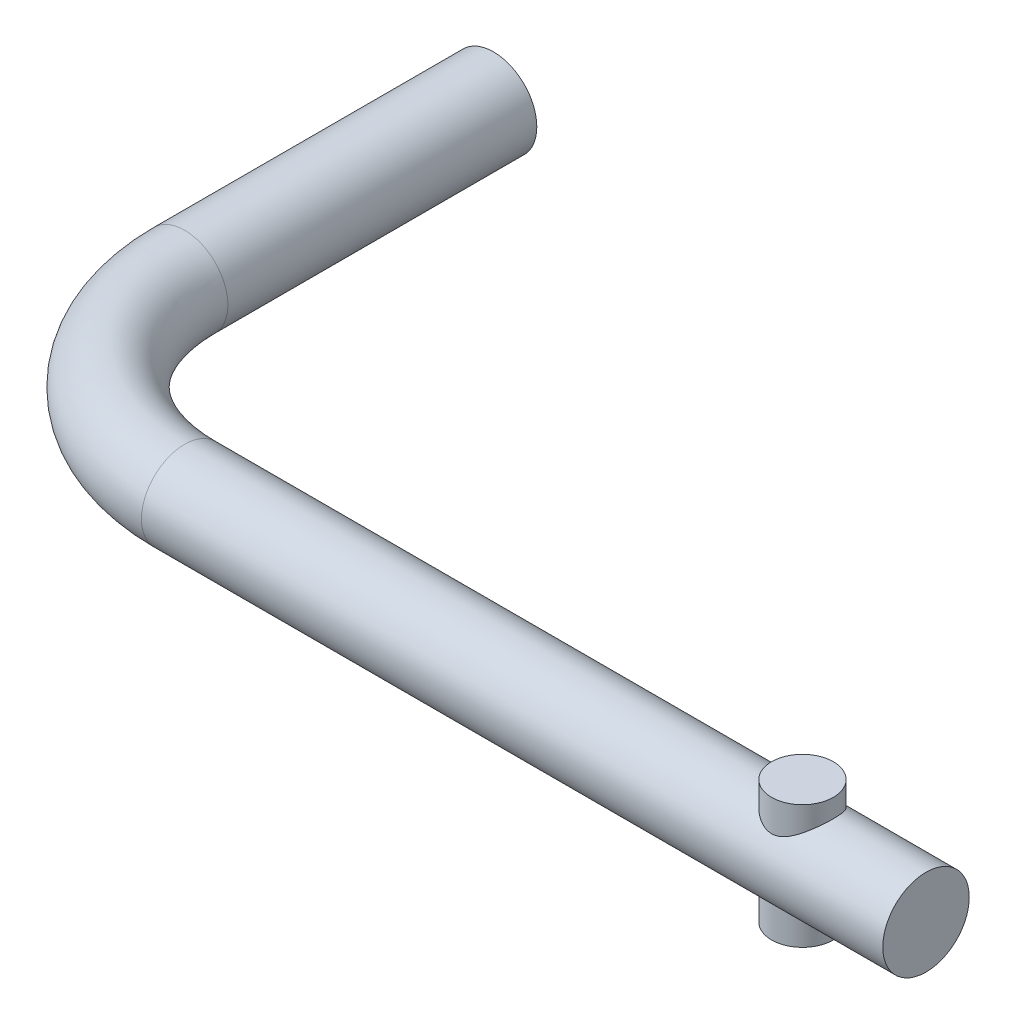
ISO-10303-21;
HEADER;
FILE_DESCRIPTION(('STEP AP214'),'2;1');
FILE_NAME('part.step','',(''),(''),'','','');
FILE_SCHEMA(('AUTOMOTIVE_DESIGN { 1 0 10303 214 1 1 1 1 }'));
ENDSEC;
DATA;
#1=APPLICATION_CONTEXT('core data for automotive mechanical design processes');
#2=APPLICATION_PROTOCOL_DEFINITION('international standard','automotive_design',2000,#1);
#3=PRODUCT_CONTEXT('',#1,'mechanical');
#4=PRODUCT('Part','Part','',(#3));
#5=PRODUCT_RELATED_PRODUCT_CATEGORY('part','',(#4));
#6=PRODUCT_DEFINITION_FORMATION('','',#4);
#7=PRODUCT_DEFINITION_CONTEXT('part definition',#1,'design');
#8=PRODUCT_DEFINITION('design','',#6,#7);
#9=PRODUCT_DEFINITION_SHAPE('','',#8);
#10=(LENGTH_UNIT() NAMED_UNIT(*) SI_UNIT(.MILLI.,.METRE.));
#11=(NAMED_UNIT(*) PLANE_ANGLE_UNIT() SI_UNIT($,.RADIAN.));
#12=(NAMED_UNIT(*) SI_UNIT($,.STERADIAN.) SOLID_ANGLE_UNIT());
#13=UNCERTAINTY_MEASURE_WITH_UNIT(LENGTH_MEASURE(1.E-05),#10,'distance_accuracy_value','');
#14=(GEOMETRIC_REPRESENTATION_CONTEXT(3) GLOBAL_UNCERTAINTY_ASSIGNED_CONTEXT((#13)) GLOBAL_UNIT_ASSIGNED_CONTEXT((#10,
#11,#12)) REPRESENTATION_CONTEXT('',''));
#15=CARTESIAN_POINT('',(0.,0.,0.));
#16=DIRECTION('',(0.,0.,1.));
#17=DIRECTION('',(1.,0.,0.));
#18=AXIS2_PLACEMENT_3D('',#15,#16,#17);
#19=CARTESIAN_POINT('',(0.,0.,0.));
#20=DIRECTION('',(1.,0.,0.));
#21=DIRECTION('',(0.,0.,-1.));
#22=AXIS2_PLACEMENT_3D('',#19,#20,#21);
#23=PLANE('',#22);
#24=CARTESIAN_POINT('',(0.,0.,0.));
#25=DIRECTION('',(1.,0.,0.));
#26=DIRECTION('',(0.,0.,-1.));
#27=AXIS2_PLACEMENT_3D('',#24,#25,#26);
#28=CIRCLE('',#27,7.00000000000001);
#29=CARTESIAN_POINT('',(0.,0.,-7.00000000000001));
#30=VERTEX_POINT('',#29);
#31=EDGE_CURVE('E113',#30,#30,#28,.T.);
#32=ORIENTED_EDGE('',*,*,#31,.T.);
#33=EDGE_LOOP('',(#32));
#34=FACE_BOUND('',#33,.T.);
#35=ADVANCED_FACE('F49',(#34),#23,.T.);
#36=CARTESIAN_POINT('',(-150.,0.,-80.));
#37=DIRECTION('',(0.,0.,1.));
#38=DIRECTION('',(1.,0.,0.));
#39=AXIS2_PLACEMENT_3D('',#36,#37,#38);
#40=PLANE('',#39);
#41=CARTESIAN_POINT('',(-150.,0.,-80.));
#42=DIRECTION('',(0.,0.,1.));
#43=DIRECTION('',(1.,0.,0.));
#44=AXIS2_PLACEMENT_3D('',#41,#42,#43);
#45=CIRCLE('',#44,7.00000000000001);
#46=CARTESIAN_POINT('',(-143.,0.,-80.));
#47=VERTEX_POINT('',#46);
#48=EDGE_CURVE('E11',#47,#47,#45,.T.);
#49=ORIENTED_EDGE('',*,*,#48,.F.);
#50=EDGE_LOOP('',(#49));
#51=FACE_BOUND('',#50,.T.);
#52=ADVANCED_FACE('F105',(#51),#40,.F.);
#53=CARTESIAN_POINT('',(0.,0.,0.));
#54=DIRECTION('',(-1.,0.,0.));
#55=DIRECTION('',(0.,0.,1.));
#56=AXIS2_PLACEMENT_3D('',#53,#54,#55);
#57=CYLINDRICAL_SURFACE('',#56,7.00000000000001);
#58=CARTESIAN_POINT('',(-20.,-4.89897948556637,5.));
#59=CARTESIAN_POINT('',(-19.8808879185152,-4.89897908615778,5.00000019788096));
#60=CARTESIAN_POINT('',(-19.7617781758625,-4.90334462003196,4.99573415755003));
#61=CARTESIAN_POINT('',(-19.5247859184536,-4.92055434168551,4.97878383625713));
#62=CARTESIAN_POINT('',(-19.406903440007,-4.93339877960088,4.96609930694141));
#63=CARTESIAN_POINT('',(-19.1732117437408,-4.96690792357521,4.93258379559617));
#64=CARTESIAN_POINT('',(-19.0574069358162,-4.98758758080823,4.91173723621803));
#65=CARTESIAN_POINT('',(-18.8288818525877,-5.03577388506691,4.8623215386829));
#66=CARTESIAN_POINT('',(-18.7161633843954,-5.063284440662,4.83374797837891));
#67=CARTESIAN_POINT('',(-18.3863310323717,-5.15360173806982,4.7379331530823));
#68=CARTESIAN_POINT('',(-18.1744688742483,-5.22468843209763,4.66013652896456));
#69=CARTESIAN_POINT('',(-17.7675057349257,-5.38038441462557,4.47947122614936));
#70=CARTESIAN_POINT('',(-17.5724041013764,-5.4649931764552,4.37660352386249));
#71=CARTESIAN_POINT('',(-17.1649894997844,-5.65679190576273,4.12672515549862));
#72=CARTESIAN_POINT('',(-16.9561283168679,-5.76527021170379,3.9750733473289));
#73=CARTESIAN_POINT('',(-16.5636248483655,-5.98179747098095,3.6411199886308));
#74=CARTESIAN_POINT('',(-16.3800165271237,-6.08984565989307,3.45877787912081));
#75=CARTESIAN_POINT('',(-16.110910808962,-6.25450709478583,3.14616285214747));
#76=CARTESIAN_POINT('',(-16.0161109352745,-6.31400438100289,3.02530167022396));
#77=CARTESIAN_POINT('',(-15.8371155846797,-6.42844115076156,2.77384325486241));
#78=CARTESIAN_POINT('',(-15.7529221773595,-6.48337974407655,2.64324412919749));
#79=CARTESIAN_POINT('',(-15.5963109331578,-6.58703600091247,2.37315221584864));
#80=CARTESIAN_POINT('',(-15.5238731717436,-6.63576415969448,2.23367504626234));
#81=CARTESIAN_POINT('',(-15.3917351237321,-6.7256045068677,1.94649568995305));
#82=CARTESIAN_POINT('',(-15.332028972431,-6.76672020071888,1.79879732995991));
#83=CARTESIAN_POINT('',(-15.2411829370065,-6.82975793341869,1.53851362799842));
#84=CARTESIAN_POINT('',(-15.2067175991263,-6.85383692648986,1.42759816241186));
#85=CARTESIAN_POINT('',(-15.1454085756439,-6.89685285069204,1.20271182993495));
#86=CARTESIAN_POINT('',(-15.1185633419403,-6.91579082623875,1.08874158880987));
#87=CARTESIAN_POINT('',(-15.0728584756589,-6.94812658420125,0.858511360054602));
#88=CARTESIAN_POINT('',(-15.0539937038245,-6.96152793196328,0.742252896637179));
#89=CARTESIAN_POINT('',(-15.024491905551,-6.98251910623047,0.508167911151184));
#90=CARTESIAN_POINT('',(-15.0138551630181,-6.99010873220353,0.390341335117953));
#91=CARTESIAN_POINT('',(-15.0009583942623,-6.9993139969645,0.153765047874478));
#92=CARTESIAN_POINT('',(-14.9987147515946,-7.00091795154717,0.035013984117521));
#93=CARTESIAN_POINT('',(-15.0026848556533,-6.99808236326006,-0.202316668015532));
#94=CARTESIAN_POINT('',(-15.0089016628968,-6.99364063340009,-0.32089617879707));
#95=CARTESIAN_POINT('',(-15.0297011262875,-6.97881206447308,-0.556922487671895));
#96=CARTESIAN_POINT('',(-15.0442825009574,-6.96842613607595,-0.674369456472179));
#97=CARTESIAN_POINT('',(-15.0816011057889,-6.94193599249165,-0.907346528259756));
#98=CARTESIAN_POINT('',(-15.104341486687,-6.92582956826371,-1.02287587266713));
#99=CARTESIAN_POINT('',(-15.1569587347692,-6.88873785724732,-1.24818915783401));
#100=CARTESIAN_POINT('',(-15.18663071895,-6.86789303133328,-1.35804423044467));
#101=CARTESIAN_POINT('',(-15.2530528588269,-6.82150615548274,-1.57459108920092));
#102=CARTESIAN_POINT('',(-15.2898054555214,-6.79596248578593,-1.68128176976194));
#103=CARTESIAN_POINT('',(-15.4100919670095,-6.71296176819878,-1.99575473490875));
#104=CARTESIAN_POINT('',(-15.5036939262413,-6.64910679635689,-2.19810327629145));
#105=CARTESIAN_POINT('',(-15.7261762067006,-6.50061180491959,-2.60662874808807));
#106=CARTESIAN_POINT('',(-15.8578265099098,-6.41444805550666,-2.81071653046189));
#107=CARTESIAN_POINT('',(-16.1465873870821,-6.23187144989638,-3.19516416650198));
#108=CARTESIAN_POINT('',(-16.3037237760836,-6.13544823624003,-3.37549962209022));
#109=CARTESIAN_POINT('',(-16.5718992443044,-5.97874175715043,-3.64252119679408));
#110=CARTESIAN_POINT('',(-16.6756487212352,-5.91973318665209,-3.73743609237306));
#111=CARTESIAN_POINT('',(-16.8907387250385,-5.80167332012736,-3.91819121769464));
#112=CARTESIAN_POINT('',(-17.0020776272724,-5.74262203590567,-4.00403337962947));
#113=CARTESIAN_POINT('',(-17.2321321637283,-5.62594589219655,-4.16638051834583));
#114=CARTESIAN_POINT('',(-17.3508494076143,-5.56832134782911,-4.24288344680696));
#115=CARTESIAN_POINT('',(-17.5953869002532,-5.45622070451083,-4.38610679182064));
#116=CARTESIAN_POINT('',(-17.7212060314621,-5.40174411291732,-4.45282874158471));
#117=CARTESIAN_POINT('',(-18.0509423262455,-5.26926955109653,-4.60980841099857));
#118=CARTESIAN_POINT('',(-18.2598563886596,-5.19475158863372,-4.69291290637748));
#119=CARTESIAN_POINT('',(-18.5841808059375,-5.0984216076476,-4.7967012749124));
#120=CARTESIAN_POINT('',(-18.6940753987815,-5.06889350154026,-4.8278123225541));
#121=CARTESIAN_POINT('',(-18.9171328388322,-5.01606193101397,-4.88268065838727));
#122=CARTESIAN_POINT('',(-19.0302939763307,-4.99275527347992,-4.90644171990616));
#123=CARTESIAN_POINT('',(-19.2606254469064,-4.95314613112201,-4.9464281935832));
#124=CARTESIAN_POINT('',(-19.3778278236867,-4.93693241125806,-4.96255830023198));
#125=CARTESIAN_POINT('',(-19.6139336662868,-4.91276529510886,-4.98648462395711));
#126=CARTESIAN_POINT('',(-19.7328370458264,-4.90481148135088,-4.99428126222476));
#127=CARTESIAN_POINT('',(-19.9710998209506,-4.89761951095174,-5.0013351087614));
#128=CARTESIAN_POINT('',(-20.0904589029423,-4.89837616885436,-5.00059739763744));
#129=CARTESIAN_POINT('',(-20.3284131753474,-4.90853230709168,-4.99062605993573));
#130=CARTESIAN_POINT('',(-20.4470084124054,-4.91793125454453,-4.98139295718209));
#131=CARTESIAN_POINT('',(-20.7626254637137,-4.9540997698318,-4.94550093009837));
#132=CARTESIAN_POINT('',(-20.9579970314413,-4.98834309549852,-4.91125354451111));
#133=CARTESIAN_POINT('',(-21.3393321645172,-5.07534016881799,-4.82128358630942));
#134=CARTESIAN_POINT('',(-21.5252843641478,-5.12811569659616,-4.7655357374838));
#135=CARTESIAN_POINT('',(-21.9725324551848,-5.27515091346019,-4.60322840699409));
#136=CARTESIAN_POINT('',(-22.2271464949867,-5.37716321251341,-4.48512373614704));
#137=CARTESIAN_POINT('',(-22.5884668258432,-5.5397293284759,-4.28008326632929));
#138=CARTESIAN_POINT('',(-22.7056237701902,-5.59559468263678,-4.20696657730157));
#139=CARTESIAN_POINT('',(-22.932971658214,-5.70899546493018,-4.05174044015439));
#140=CARTESIAN_POINT('',(-23.0431634341202,-5.76653069233552,-3.96963206961681));
#141=CARTESIAN_POINT('',(-23.3677758354402,-5.94206470641831,-3.70633514569965));
#142=CARTESIAN_POINT('',(-23.5709185936884,-6.06048209409867,-3.51119446215838));
#143=CARTESIAN_POINT('',(-23.9436519392104,-6.28734240734788,-3.08662562980055));
#144=CARTESIAN_POINT('',(-24.1132887658833,-6.39579896697972,-2.85724551165145));
#145=CARTESIAN_POINT('',(-24.3916181098767,-6.57852741022862,-2.40283375918482));
#146=CARTESIAN_POINT('',(-24.5056151809344,-6.65548309428902,-2.18218597939087));
#147=CARTESIAN_POINT('',(-24.6521470267492,-6.75582916399722,-1.83663680938027));
#148=CARTESIAN_POINT('',(-24.6969232240788,-6.78677013847847,-1.71898751805069));
#149=CARTESIAN_POINT('',(-24.7777817072192,-6.84297797147041,-1.47944436100626));
#150=CARTESIAN_POINT('',(-24.8138678338073,-6.86824733634296,-1.35755239780271));
#151=CARTESIAN_POINT('',(-24.8770468352244,-6.91267524210074,-1.10946475966587));
#152=CARTESIAN_POINT('',(-24.9040776168899,-6.93179155744312,-0.983245660104105));
#153=CARTESIAN_POINT('',(-24.9483716611747,-6.96319879076668,-0.728257545604028));
#154=CARTESIAN_POINT('',(-24.9656348758676,-6.97548967525762,-0.599488518157227));
#155=CARTESIAN_POINT('',(-24.9900817593572,-6.99291373131905,-0.340568017168596));
#156=CARTESIAN_POINT('',(-24.9972696644276,-6.99804991115743,-0.210417147844235));
#157=CARTESIAN_POINT('',(-25.0014455810858,-7.00103243594555,0.0501254143712786));
#158=CARTESIAN_POINT('',(-24.9984345209627,-6.99887944434089,0.1805170842656));
#159=CARTESIAN_POINT('',(-24.9831451979319,-6.98796912318509,0.426328553143654));
#160=CARTESIAN_POINT('',(-24.9719005641711,-6.97994849968885,0.541847544384525));
#161=CARTESIAN_POINT('',(-24.9415002925568,-6.95832673601406,0.771348349419918));
#162=CARTESIAN_POINT('',(-24.9223420335978,-6.94472374688619,0.885329640977477));
#163=CARTESIAN_POINT('',(-24.8763785262849,-6.91222124876214,1.11093572057201));
#164=CARTESIAN_POINT('',(-24.8495754002312,-6.89332320975649,1.22256115339771));
#165=CARTESIAN_POINT('',(-24.7886596073768,-6.85060541586058,1.44285175149098));
#166=CARTESIAN_POINT('',(-24.7545441068468,-6.82678375307038,1.55151575067528));
#167=CARTESIAN_POINT('',(-24.6400518190566,-6.74736775281794,1.87711473343394));
#168=CARTESIAN_POINT('',(-24.5485866656038,-6.68458460506487,2.0885305206196));
#169=CARTESIAN_POINT('',(-24.3401793415394,-6.54455599938193,2.4929363761146));
#170=CARTESIAN_POINT('',(-24.2232324686044,-6.46730787249673,2.68592303409876));
#171=CARTESIAN_POINT('',(-23.9472028245591,-6.29026908112574,3.07993965026165));
#172=CARTESIAN_POINT('',(-23.7844037168602,-6.18883907279911,3.277623644719));
#173=CARTESIAN_POINT('',(-23.4322488438042,-5.97997655678272,3.64479834991686));
#174=CARTESIAN_POINT('',(-23.2428438709024,-5.87253315399717,3.81423551871028));
#175=CARTESIAN_POINT('',(-22.9233059528158,-5.70400810095593,4.05911432091817));
#176=CARTESIAN_POINT('',(-22.8010473350758,-5.6421260923047,4.14445310721913));
#177=CARTESIAN_POINT('',(-22.5483645099812,-5.52103685940288,4.30443989206569));
#178=CARTESIAN_POINT('',(-22.4179382236232,-5.46183032282527,4.37908515264813));
#179=CARTESIAN_POINT('',(-22.1494089413572,-5.34838059471622,4.51694429447163));
#180=CARTESIAN_POINT('',(-22.0113187722941,-5.29412948950637,4.58017656534673));
#181=CARTESIAN_POINT('',(-21.7275505002763,-5.19296464782251,4.69456637236541));
#182=CARTESIAN_POINT('',(-21.5818718427188,-5.14605144864334,4.74572302444969));
#183=CARTESIAN_POINT('',(-21.3191157749622,-5.07229356217917,4.8243152613173));
#184=CARTESIAN_POINT('',(-21.2034538532674,-5.04332831706934,4.85449916913467));
#185=CARTESIAN_POINT('',(-20.9688361255159,-4.9925495087466,4.90670753254347));
#186=CARTESIAN_POINT('',(-20.8498831434943,-4.97073000833633,4.92873876395156));
#187=CARTESIAN_POINT('',(-20.6097689705661,-4.93535822896098,4.96415847661892));
#188=CARTESIAN_POINT('',(-20.4886138924008,-4.92178585956929,4.9775679655513));
#189=CARTESIAN_POINT('',(-20.2449716627423,-4.90359697247421,4.99548834804153));
#190=CARTESIAN_POINT('',(-20.1224845947964,-4.89897989628372,4.99999979651628));
#191=CARTESIAN_POINT('',(-20.,-4.89897948556637,5.));
#192=B_SPLINE_CURVE_WITH_KNOTS('',3,(#58,#59,#60,#61,#62,#63,#64,#65,#66,#67,#68,#69,#70,#71,
#72,#73,#74,#75,#76,#77,#78,#79,#80,#81,#82,#83,#84,#85,#86,#87,#88,#89,#90,#91,#92,#93,#94,#95,
#96,#97,#98,#99,#100,#101,#102,#103,#104,#105,#106,#107,#108,#109,#110,#111,#112,#113,#114,#115,
#116,#117,#118,#119,#120,#121,#122,#123,#124,#125,#126,#127,#128,#129,#130,#131,#132,#133,#134,
#135,#136,#137,#138,#139,#140,#141,#142,#143,#144,#145,#146,#147,#148,#149,#150,#151,#152,#153,
#154,#155,#156,#157,#158,#159,#160,#161,#162,#163,#164,#165,#166,#167,#168,#169,#170,#171,#172,
#173,#174,#175,#176,#177,#178,#179,#180,#181,#182,#183,#184,#185,#186,#187,#188,#189,#190,#191),
.UNSPECIFIED.,.T.,.F.,(4,2,2,2,2,2,2,2,2,2,2,2,2,2,2,2,2,2,2,2,2,2,2,2,2,2,2,2,2,2,2,2,2,2,2,2,
2,2,2,2,2,2,2,2,2,2,2,2,2,2,2,2,2,2,2,2,2,2,2,2,2,2,2,2,2,2,4),(0.,0.357179224350197,
0.714368986309918,1.07224379920534,1.43032385816536,2.13717251113089,2.84399363978165,
3.68104205097159,4.51920548229731,5.01279154518472,5.50647377037362,5.9993103164021,
6.49191934885209,6.84740956232524,7.20282750258062,7.55801621113095,7.91321717483286,
8.26911113958429,8.62513388107041,8.98110209334731,9.33720791691035,9.68388561620712,
10.0306830450948,10.7237665684956,11.4941350433091,12.2652887597734,12.7223782704213,
13.1793702391326,13.6364622578756,14.0934825486357,14.8010785406531,15.1546369551107,
15.508013557753,15.8656941258335,16.2233566151193,16.5808061943249,16.9382337347385,
17.5393225125418,18.1411201024382,19.0318005816484,19.4783995312192,19.9249450178902,
20.8376513563764,21.7490891887235,22.5255899396739,22.9140682910686,23.3023746290684,
23.693291570444,24.0842104299097,24.4749648739274,24.8656837532241,25.2142975726098,
25.5630269505635,25.9116596114256,26.2604276212735,26.9736540085442,27.6870121242051,
28.5103350386147,29.3352012440718,29.8189986384765,30.302919683496,30.7860538917519,
31.2692234594306,31.6377462890185,32.0059621419414,32.3732773683434,32.7405696867955),.UNSPECIFIED.);
#193=CARTESIAN_POINT('',(-20.,-4.89897948556637,5.));
#194=VERTEX_POINT('',#193);
#195=EDGE_CURVE('E52',#194,#194,#192,.T.);
#196=ORIENTED_EDGE('',*,*,#195,.T.);
#197=EDGE_LOOP('',(#196));
#198=FACE_BOUND('',#197,.T.);
#199=CARTESIAN_POINT('',(-20.,4.89897948556637,5.));
#200=CARTESIAN_POINT('',(-20.1191120814848,4.89897908615778,5.00000019788096));
#201=CARTESIAN_POINT('',(-20.2382218241375,4.90334462003196,4.99573415755003));
#202=CARTESIAN_POINT('',(-20.4752140815464,4.92055434168551,4.97878383625713));
#203=CARTESIAN_POINT('',(-20.593096559993,4.93339877960088,4.96609930694141));
#204=CARTESIAN_POINT('',(-20.8267882562592,4.96690792357521,4.93258379559617));
#205=CARTESIAN_POINT('',(-20.9425930641838,4.98758758080823,4.91173723621803));
#206=CARTESIAN_POINT('',(-21.1711181474123,5.03577388506691,4.8623215386829));
#207=CARTESIAN_POINT('',(-21.2838366156046,5.063284440662,4.83374797837891));
#208=CARTESIAN_POINT('',(-21.6136689676283,5.15360173806982,4.7379331530823));
#209=CARTESIAN_POINT('',(-21.8255311257517,5.22468843209763,4.66013652896456));
#210=CARTESIAN_POINT('',(-22.2324942650743,5.38038441462557,4.47947122614936));
#211=CARTESIAN_POINT('',(-22.4275958986236,5.46499317645519,4.37660352386249));
#212=CARTESIAN_POINT('',(-22.8350105002156,5.65679190576273,4.12672515549862));
#213=CARTESIAN_POINT('',(-23.0438716831321,5.76527021170379,3.9750733473289));
#214=CARTESIAN_POINT('',(-23.4363751516345,5.98179747098095,3.6411199886308));
#215=CARTESIAN_POINT('',(-23.6199834728763,6.08984565989307,3.45877787912081));
#216=CARTESIAN_POINT('',(-23.889089191038,6.25450709478583,3.14616285214747));
#217=CARTESIAN_POINT('',(-23.9838890647255,6.31400438100289,3.02530167022396));
#218=CARTESIAN_POINT('',(-24.1628844153203,6.42844115076156,2.77384325486241));
#219=CARTESIAN_POINT('',(-24.2470778226405,6.48337974407655,2.64324412919749));
#220=CARTESIAN_POINT('',(-24.4036890668422,6.58703600091247,2.37315221584864));
#221=CARTESIAN_POINT('',(-24.4761268282564,6.63576415969448,2.23367504626234));
#222=CARTESIAN_POINT('',(-24.6082648762679,6.7256045068677,1.94649568995305));
#223=CARTESIAN_POINT('',(-24.667971027569,6.76672020071888,1.79879732995991));
#224=CARTESIAN_POINT('',(-24.7588170629935,6.82975793341869,1.53851362799842));
#225=CARTESIAN_POINT('',(-24.7932824008737,6.85383692648986,1.42759816241186));
#226=CARTESIAN_POINT('',(-24.8545914243561,6.89685285069204,1.20271182993495));
#227=CARTESIAN_POINT('',(-24.8814366580597,6.91579082623875,1.08874158880987));
#228=CARTESIAN_POINT('',(-24.9271415243411,6.94812658420125,0.858511360054603));
#229=CARTESIAN_POINT('',(-24.9460062961755,6.96152793196328,0.742252896637179));
#230=CARTESIAN_POINT('',(-24.975508094449,6.98251910623047,0.508167911151184));
#231=CARTESIAN_POINT('',(-24.9861448369819,6.99010873220353,0.390341335117953));
#232=CARTESIAN_POINT('',(-24.9990416057377,6.9993139969645,0.153765047874477));
#233=CARTESIAN_POINT('',(-25.0012852484054,7.00091795154717,0.0350139841175207));
#234=CARTESIAN_POINT('',(-24.9973151443467,6.99808236326006,-0.202316668015532));
#235=CARTESIAN_POINT('',(-24.9910983371032,6.99364063340009,-0.320896178797069));
#236=CARTESIAN_POINT('',(-24.9702988737125,6.97881206447308,-0.556922487671893));
#237=CARTESIAN_POINT('',(-24.9557174990426,6.96842613607595,-0.674369456472178));
#238=CARTESIAN_POINT('',(-24.9183988942111,6.94193599249165,-0.907346528259755));
#239=CARTESIAN_POINT('',(-24.895658513313,6.92582956826371,-1.02287587266713));
#240=CARTESIAN_POINT('',(-24.8430412652308,6.88873785724732,-1.24818915783401));
#241=CARTESIAN_POINT('',(-24.8133692810501,6.86789303133328,-1.35804423044467));
#242=CARTESIAN_POINT('',(-24.7469471411731,6.82150615548274,-1.57459108920092));
#243=CARTESIAN_POINT('',(-24.7101945444786,6.79596248578593,-1.68128176976194));
#244=CARTESIAN_POINT('',(-24.5899080329905,6.71296176819878,-1.99575473490875));
#245=CARTESIAN_POINT('',(-24.4963060737587,6.64910679635689,-2.19810327629145));
#246=CARTESIAN_POINT('',(-24.2738237932994,6.50061180491959,-2.60662874808807));
#247=CARTESIAN_POINT('',(-24.1421734900902,6.41444805550666,-2.81071653046189));
#248=CARTESIAN_POINT('',(-23.8534126129179,6.23187144989638,-3.19516416650198));
#249=CARTESIAN_POINT('',(-23.6962762239164,6.13544823624003,-3.37549962209022));
#250=CARTESIAN_POINT('',(-23.4281007556956,5.97874175715043,-3.64252119679408));
#251=CARTESIAN_POINT('',(-23.3243512787648,5.91973318665209,-3.73743609237306));
#252=CARTESIAN_POINT('',(-23.1092612749615,5.80167332012736,-3.91819121769464));
#253=CARTESIAN_POINT('',(-22.9979223727276,5.74262203590567,-4.00403337962947));
#254=CARTESIAN_POINT('',(-22.7678678362717,5.62594589219655,-4.16638051834583));
#255=CARTESIAN_POINT('',(-22.6491505923857,5.56832134782911,-4.24288344680696));
#256=CARTESIAN_POINT('',(-22.4046130997468,5.45622070451083,-4.38610679182064));
#257=CARTESIAN_POINT('',(-22.2787939685379,5.40174411291732,-4.45282874158471));
#258=CARTESIAN_POINT('',(-21.9490576737545,5.26926955109653,-4.60980841099857));
#259=CARTESIAN_POINT('',(-21.7401436113404,5.19475158863372,-4.69291290637748));
#260=CARTESIAN_POINT('',(-21.4158191940625,5.0984216076476,-4.79670127491239));
#261=CARTESIAN_POINT('',(-21.3059246012185,5.06889350154026,-4.8278123225541));
#262=CARTESIAN_POINT('',(-21.0828671611678,5.01606193101397,-4.88268065838727));
#263=CARTESIAN_POINT('',(-20.9697060236693,4.99275527347992,-4.90644171990616));
#264=CARTESIAN_POINT('',(-20.7393745530936,4.95314613112201,-4.9464281935832));
#265=CARTESIAN_POINT('',(-20.6221721763133,4.93693241125806,-4.96255830023198));
#266=CARTESIAN_POINT('',(-20.3860663337132,4.91276529510886,-4.98648462395711));
#267=CARTESIAN_POINT('',(-20.2671629541736,4.90481148135088,-4.99428126222476));
#268=CARTESIAN_POINT('',(-20.0289001790494,4.89761951095174,-5.0013351087614));
#269=CARTESIAN_POINT('',(-19.9095410970577,4.89837616885436,-5.00059739763744));
#270=CARTESIAN_POINT('',(-19.6715868246526,4.90853230709168,-4.99062605993573));
#271=CARTESIAN_POINT('',(-19.5529915875946,4.91793125454453,-4.98139295718209));
#272=CARTESIAN_POINT('',(-19.2373745362863,4.95409976983179,-4.94550093009837));
#273=CARTESIAN_POINT('',(-19.0420029685587,4.98834309549852,-4.91125354451111));
#274=CARTESIAN_POINT('',(-18.6606678354828,5.07534016881798,-4.82128358630943));
#275=CARTESIAN_POINT('',(-18.4747156358522,5.12811569659616,-4.7655357374838));
#276=CARTESIAN_POINT('',(-18.0274675448152,5.27515091346019,-4.60322840699409));
#277=CARTESIAN_POINT('',(-17.7728535050133,5.37716321251341,-4.48512373614704));
#278=CARTESIAN_POINT('',(-17.4115331741568,5.5397293284759,-4.28008326632929));
#279=CARTESIAN_POINT('',(-17.2943762298098,5.59559468263678,-4.20696657730157));
#280=CARTESIAN_POINT('',(-17.067028341786,5.70899546493018,-4.0517404401544));
#281=CARTESIAN_POINT('',(-16.9568365658798,5.76653069233552,-3.96963206961681));
#282=CARTESIAN_POINT('',(-16.6322241645598,5.94206470641831,-3.70633514569966));
#283=CARTESIAN_POINT('',(-16.4290814063116,6.06048209409867,-3.51119446215838));
#284=CARTESIAN_POINT('',(-16.0563480607896,6.28734240734787,-3.08662562980056));
#285=CARTESIAN_POINT('',(-15.8867112341167,6.39579896697972,-2.85724551165145));
#286=CARTESIAN_POINT('',(-15.6083818901233,6.57852741022862,-2.40283375918482));
#287=CARTESIAN_POINT('',(-15.4943848190656,6.65548309428902,-2.18218597939087));
#288=CARTESIAN_POINT('',(-15.3478529732508,6.75582916399722,-1.83663680938027));
#289=CARTESIAN_POINT('',(-15.3030767759212,6.78677013847846,-1.7189875180507));
#290=CARTESIAN_POINT('',(-15.2222182927808,6.84297797147041,-1.47944436100627));
#291=CARTESIAN_POINT('',(-15.1861321661927,6.86824733634296,-1.35755239780272));
#292=CARTESIAN_POINT('',(-15.1229531647756,6.91267524210074,-1.10946475966587));
#293=CARTESIAN_POINT('',(-15.0959223831101,6.93179155744312,-0.983245660104111));
#294=CARTESIAN_POINT('',(-15.0516283388253,6.96319879076668,-0.728257545604032));
#295=CARTESIAN_POINT('',(-15.0343651241324,6.97548967525762,-0.599488518157229));
#296=CARTESIAN_POINT('',(-15.0099182406428,6.99291373131905,-0.340568017168597));
#297=CARTESIAN_POINT('',(-15.0027303355724,6.99804991115743,-0.210417147844236));
#298=CARTESIAN_POINT('',(-14.9985544189142,7.00103243594555,0.0501254143712768));
#299=CARTESIAN_POINT('',(-15.0015654790373,6.99887944434089,0.180517084265598));
#300=CARTESIAN_POINT('',(-15.0168548020681,6.98796912318509,0.42632855314365));
#301=CARTESIAN_POINT('',(-15.0280994358289,6.97994849968886,0.541847544384519));
#302=CARTESIAN_POINT('',(-15.0584997074432,6.95832673601406,0.771348349419912));
#303=CARTESIAN_POINT('',(-15.0776579664022,6.94472374688619,0.885329640977471));
#304=CARTESIAN_POINT('',(-15.1236214737151,6.91222124876214,1.110935720572));
#305=CARTESIAN_POINT('',(-15.1504245997688,6.89332320975649,1.2225611533977));
#306=CARTESIAN_POINT('',(-15.2113403926232,6.85060541586058,1.44285175149098));
#307=CARTESIAN_POINT('',(-15.2454558931532,6.82678375307038,1.55151575067528));
#308=CARTESIAN_POINT('',(-15.3599481809434,6.74736775281794,1.87711473343393));
#309=CARTESIAN_POINT('',(-15.4514133343962,6.68458460506487,2.0885305206196));
#310=CARTESIAN_POINT('',(-15.6598206584606,6.54455599938193,2.4929363761146));
#311=CARTESIAN_POINT('',(-15.7767675313956,6.46730787249673,2.68592303409876));
#312=CARTESIAN_POINT('',(-16.0527971754409,6.29026908112574,3.07993965026165));
#313=CARTESIAN_POINT('',(-16.2155962831398,6.18883907279911,3.277623644719));
#314=CARTESIAN_POINT('',(-16.5677511561958,5.97997655678272,3.64479834991686));
#315=CARTESIAN_POINT('',(-16.7571561290976,5.87253315399717,3.81423551871028));
#316=CARTESIAN_POINT('',(-17.0766940471842,5.70400810095593,4.05911432091817));
#317=CARTESIAN_POINT('',(-17.1989526649242,5.6421260923047,4.14445310721912));
#318=CARTESIAN_POINT('',(-17.4516354900188,5.52103685940288,4.30443989206569));
#319=CARTESIAN_POINT('',(-17.5820617763768,5.46183032282527,4.37908515264813));
#320=CARTESIAN_POINT('',(-17.8505910586428,5.34838059471622,4.51694429447163));
#321=CARTESIAN_POINT('',(-17.9886812277059,5.29412948950637,4.58017656534673));
#322=CARTESIAN_POINT('',(-18.2724494997237,5.19296464782251,4.69456637236541));
#323=CARTESIAN_POINT('',(-18.4181281572812,5.14605144864334,4.74572302444969));
#324=CARTESIAN_POINT('',(-18.6808842250378,5.07229356217917,4.82431526131729));
#325=CARTESIAN_POINT('',(-18.7965461467326,5.04332831706934,4.85449916913467));
#326=CARTESIAN_POINT('',(-19.0311638744841,4.9925495087466,4.90670753254347));
#327=CARTESIAN_POINT('',(-19.1501168565057,4.97073000833633,4.92873876395156));
#328=CARTESIAN_POINT('',(-19.3902310294339,4.93535822896098,4.96415847661892));
#329=CARTESIAN_POINT('',(-19.5113861075992,4.92178585956929,4.9775679655513));
#330=CARTESIAN_POINT('',(-19.7550283372577,4.90359697247421,4.99548834804153));
#331=CARTESIAN_POINT('',(-19.8775154052036,4.89897989628372,4.99999979651628));
#332=CARTESIAN_POINT('',(-20.,4.89897948556637,5.));
#333=B_SPLINE_CURVE_WITH_KNOTS('',3,(#199,#200,#201,#202,#203,#204,#205,#206,#207,#208,#209,
#210,#211,#212,#213,#214,#215,#216,#217,#218,#219,#220,#221,#222,#223,#224,#225,#226,#227,#228,
#229,#230,#231,#232,#233,#234,#235,#236,#237,#238,#239,#240,#241,#242,#243,#244,#245,#246,#247,
#248,#249,#250,#251,#252,#253,#254,#255,#256,#257,#258,#259,#260,#261,#262,#263,#264,#265,#266,
#267,#268,#269,#270,#271,#272,#273,#274,#275,#276,#277,#278,#279,#280,#281,#282,#283,#284,#285,
#286,#287,#288,#289,#290,#291,#292,#293,#294,#295,#296,#297,#298,#299,#300,#301,#302,#303,#304,
#305,#306,#307,#308,#309,#310,#311,#312,#313,#314,#315,#316,#317,#318,#319,#320,#321,#322,#323,
#324,#325,#326,#327,#328,#329,#330,#331,#332),.UNSPECIFIED.,.T.,.F.,(4,2,2,2,2,2,2,2,2,2,2,2,2,
2,2,2,2,2,2,2,2,2,2,2,2,2,2,2,2,2,2,2,2,2,2,2,2,2,2,2,2,2,2,2,2,2,2,2,2,2,2,2,2,2,2,2,2,2,2,2,2,
2,2,2,2,2,4),(0.,0.357179224350197,0.714368986309918,1.07224379920534,1.43032385816536,
2.13717251113088,2.84399363978165,3.68104205097159,4.51920548229731,5.01279154518472,
5.50647377037362,5.9993103164021,6.49191934885209,6.84740956232524,7.20282750258062,
7.55801621113095,7.91321717483286,8.26911113958429,8.6251338810704,8.98110209334731,
9.33720791691035,9.68388561620712,10.0306830450948,10.7237665684956,11.4941350433091,
12.2652887597734,12.7223782704213,13.1793702391326,13.6364622578756,14.0934825486357,
14.8010785406531,15.1546369551107,15.508013557753,15.8656941258335,16.2233566151193,
16.5808061943249,16.9382337347385,17.5393225125418,18.1411201024382,19.0318005816484,
19.4783995312192,19.9249450178902,20.8376513563764,21.7490891887235,22.5255899396738,
22.9140682910686,23.3023746290684,23.693291570444,24.0842104299097,24.4749648739274,
24.8656837532241,25.2142975726097,25.5630269505635,25.9116596114256,26.2604276212735,
26.9736540085442,27.6870121242051,28.5103350386147,29.3352012440718,29.8189986384765,
30.302919683496,30.7860538917519,31.2692234594306,31.6377462890185,32.0059621419414,
32.3732773683434,32.7405696867955),.UNSPECIFIED.);
#334=CARTESIAN_POINT('',(-20.,4.89897948556637,5.));
#335=VERTEX_POINT('',#334);
#336=EDGE_CURVE('E71',#335,#335,#333,.T.);
#337=ORIENTED_EDGE('',*,*,#336,.T.);
#338=EDGE_LOOP('',(#337));
#339=FACE_BOUND('',#338,.T.);
#340=CARTESIAN_POINT('',(-120.,0.,0.));
#341=DIRECTION('',(1.,0.,0.));
#342=DIRECTION('',(0.,0.,-1.));
#343=AXIS2_PLACEMENT_3D('',#340,#341,#342);
#344=CIRCLE('',#343,7.00000000000001);
#345=CARTESIAN_POINT('',(-120.,0.,7.));
#346=VERTEX_POINT('',#345);
#347=EDGE_CURVE('E68',#346,#346,#344,.T.);
#348=ORIENTED_EDGE('',*,*,#347,.T.);
#349=EDGE_LOOP('',(#348));
#350=FACE_BOUND('',#349,.T.);
#351=ORIENTED_EDGE('',*,*,#31,.F.);
#352=EDGE_LOOP('',(#351));
#353=FACE_BOUND('',#352,.T.);
#354=ADVANCED_FACE('F78',(#198,#339,#350,#353),#57,.T.);
#355=CARTESIAN_POINT('',(-120.,0.,-30.));
#356=DIRECTION('',(0.,-1.,0.));
#357=DIRECTION('',(0.,0.,-1.));
#358=AXIS2_PLACEMENT_3D('',#355,#356,#357);
#359=TOROIDAL_SURFACE('',#358,30.,7.00000000000001);
#360=CARTESIAN_POINT('',(-150.000000000001,0.,-29.9999999999992));
#361=DIRECTION('',(0.,0.,1.));
#362=DIRECTION('',(1.,0.,0.));
#363=AXIS2_PLACEMENT_3D('',#360,#361,#362);
#364=CIRCLE('',#363,7.00000000000001);
#365=CARTESIAN_POINT('',(-157.,0.,-29.999999999999));
#366=VERTEX_POINT('',#365);
#367=EDGE_CURVE('E62',#366,#366,#364,.T.);
#368=CARTESIAN_POINT('',(-120.,0.,-30.));
#369=DIRECTION('',(0.,-1.,0.));
#370=DIRECTION('',(0.,0.,-1.));
#371=AXIS2_PLACEMENT_3D('',#368,#369,#370);
#372=CIRCLE('',#371,37.);
#373=EDGE_CURVE('',#346,#366,#372,.T.);
#374=ORIENTED_EDGE('',*,*,#347,.F.);
#375=ORIENTED_EDGE('',*,*,#367,.T.);
#376=ORIENTED_EDGE('',*,*,#373,.T.);
#377=ORIENTED_EDGE('',*,*,#373,.F.);
#378=EDGE_LOOP('',(#374,#376,#375,#377));
#379=FACE_BOUND('',#378,.T.);
#380=ADVANCED_FACE('F101',(#379),#359,.T.);
#381=CARTESIAN_POINT('',(-150.,0.,-30.0000000000002));
#382=DIRECTION('',(0.,0.,-1.));
#383=DIRECTION('',(-1.,0.,0.));
#384=AXIS2_PLACEMENT_3D('',#381,#382,#383);
#385=CYLINDRICAL_SURFACE('',#384,7.00000000000001);
#386=ORIENTED_EDGE('',*,*,#48,.T.);
#387=EDGE_LOOP('',(#386));
#388=FACE_BOUND('',#387,.T.);
#389=ORIENTED_EDGE('',*,*,#367,.F.);
#390=EDGE_LOOP('',(#389));
#391=FACE_BOUND('',#390,.T.);
#392=ADVANCED_FACE('F94',(#388,#391),#385,.T.);
#393=CARTESIAN_POINT('',(-20.,10.,0.));
#394=DIRECTION('',(0.,1.,0.));
#395=DIRECTION('',(0.,0.,1.));
#396=AXIS2_PLACEMENT_3D('',#393,#394,#395);
#397=PLANE('',#396);
#398=CARTESIAN_POINT('',(-20.,10.,0.));
#399=DIRECTION('',(0.,1.,0.));
#400=DIRECTION('',(0.,0.,1.));
#401=AXIS2_PLACEMENT_3D('',#398,#399,#400);
#402=CIRCLE('',#401,5.);
#403=CARTESIAN_POINT('',(-20.,10.,5.));
#404=VERTEX_POINT('',#403);
#405=EDGE_CURVE('E125',#404,#404,#402,.T.);
#406=ORIENTED_EDGE('',*,*,#405,.T.);
#407=EDGE_LOOP('',(#406));
#408=FACE_BOUND('',#407,.T.);
#409=ADVANCED_FACE('F92',(#408),#397,.T.);
#410=CARTESIAN_POINT('',(-20.,-10.,0.));
#411=DIRECTION('',(0.,1.,0.));
#412=DIRECTION('',(0.,0.,1.));
#413=AXIS2_PLACEMENT_3D('',#410,#411,#412);
#414=CYLINDRICAL_SURFACE('',#413,5.);
#415=ORIENTED_EDGE('',*,*,#405,.F.);
#416=EDGE_LOOP('',(#415));
#417=FACE_BOUND('',#416,.T.);
#418=ORIENTED_EDGE('',*,*,#336,.F.);
#419=EDGE_LOOP('',(#418));
#420=FACE_BOUND('',#419,.T.);
#421=ADVANCED_FACE('F86',(#417,#420),#414,.T.);
#422=CARTESIAN_POINT('',(-20.,-10.,0.));
#423=DIRECTION('',(0.,1.,0.));
#424=DIRECTION('',(0.,0.,1.));
#425=AXIS2_PLACEMENT_3D('',#422,#423,#424);
#426=CIRCLE('',#425,5.);
#427=CARTESIAN_POINT('',(-20.,-10.,5.));
#428=VERTEX_POINT('',#427);
#429=EDGE_CURVE('E77',#428,#428,#426,.T.);
#430=ORIENTED_EDGE('',*,*,#429,.T.);
#431=EDGE_LOOP('',(#430));
#432=FACE_BOUND('',#431,.T.);
#433=ORIENTED_EDGE('',*,*,#195,.F.);
#434=EDGE_LOOP('',(#433));
#435=FACE_BOUND('',#434,.T.);
#436=ADVANCED_FACE('F81',(#432,#435),#414,.T.);
#437=CARTESIAN_POINT('',(-20.,-10.,0.));
#438=DIRECTION('',(0.,1.,0.));
#439=DIRECTION('',(0.,0.,1.));
#440=AXIS2_PLACEMENT_3D('',#437,#438,#439);
#441=PLANE('',#440);
#442=ORIENTED_EDGE('',*,*,#429,.F.);
#443=EDGE_LOOP('',(#442));
#444=FACE_BOUND('',#443,.T.);
#445=ADVANCED_FACE('F85',(#444),#441,.F.);
#446=CLOSED_SHELL('',(#35,#52,#354,#380,#392,#409,#421,#436,#445));
#447=MANIFOLD_SOLID_BREP('B2',#446);
#448=ADVANCED_BREP_SHAPE_REPRESENTATION('',(#18,#447),#14);
#449=SHAPE_DEFINITION_REPRESENTATION(#9,#448);
ENDSEC;
END-ISO-10303-21;
